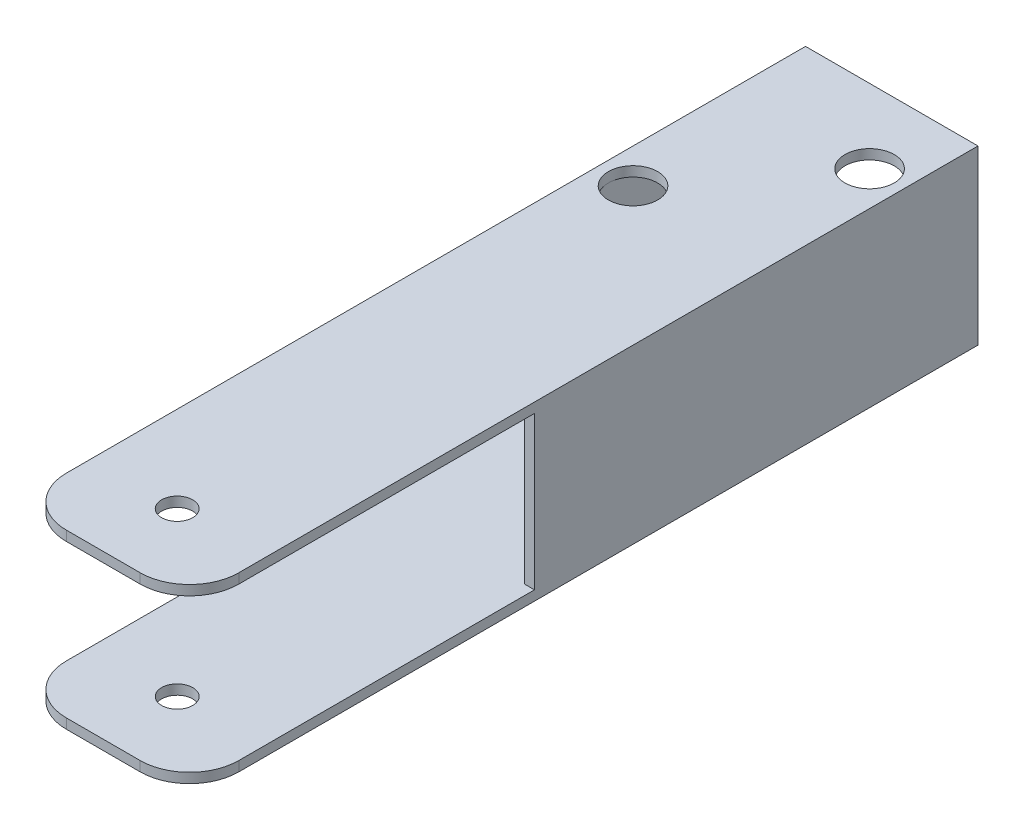
ISO-10303-21;
HEADER;
FILE_DESCRIPTION(('STEP AP214'),'2;1');
FILE_NAME('part.step','',(''),(''),'','','');
FILE_SCHEMA(('AUTOMOTIVE_DESIGN { 1 0 10303 214 1 1 1 1 }'));
ENDSEC;
DATA;
#1=APPLICATION_CONTEXT('core data for automotive mechanical design processes');
#2=APPLICATION_PROTOCOL_DEFINITION('international standard','automotive_design',2000,#1);
#3=PRODUCT_CONTEXT('',#1,'mechanical');
#4=PRODUCT('Part','Part','',(#3));
#5=PRODUCT_RELATED_PRODUCT_CATEGORY('part','',(#4));
#6=PRODUCT_DEFINITION_FORMATION('','',#4);
#7=PRODUCT_DEFINITION_CONTEXT('part definition',#1,'design');
#8=PRODUCT_DEFINITION('design','',#6,#7);
#9=PRODUCT_DEFINITION_SHAPE('','',#8);
#10=(LENGTH_UNIT() NAMED_UNIT(*) SI_UNIT(.MILLI.,.METRE.));
#11=(NAMED_UNIT(*) PLANE_ANGLE_UNIT() SI_UNIT($,.RADIAN.));
#12=(NAMED_UNIT(*) SI_UNIT($,.STERADIAN.) SOLID_ANGLE_UNIT());
#13=UNCERTAINTY_MEASURE_WITH_UNIT(LENGTH_MEASURE(1.E-05),#10,'distance_accuracy_value','');
#14=(GEOMETRIC_REPRESENTATION_CONTEXT(3) GLOBAL_UNCERTAINTY_ASSIGNED_CONTEXT((#13)) GLOBAL_UNIT_ASSIGNED_CONTEXT((#10,
#11,#12)) REPRESENTATION_CONTEXT('',''));
#15=CARTESIAN_POINT('',(0.,0.,0.));
#16=DIRECTION('',(0.,0.,1.));
#17=DIRECTION('',(1.,0.,0.));
#18=AXIS2_PLACEMENT_3D('',#15,#16,#17);
#19=CARTESIAN_POINT('',(0.,0.,185.));
#20=DIRECTION('',(0.,0.,-1.));
#21=DIRECTION('',(-1.,0.,0.));
#22=AXIS2_PLACEMENT_3D('',#19,#20,#21);
#23=PLANE('',#22);
#24=DIRECTION('',(-1.,0.,0.));
#25=VECTOR('',#24,1.);
#26=CARTESIAN_POINT('',(-15.5,15.5,185.));
#27=LINE('',#26,#25);
#28=CARTESIAN_POINT('',(7.50000000000001,15.5,185.));
#29=VERTEX_POINT('',#28);
#30=CARTESIAN_POINT('',(-7.5,15.5,185.));
#31=VERTEX_POINT('',#30);
#32=EDGE_CURVE('E251',#29,#31,#27,.T.);
#33=ORIENTED_EDGE('',*,*,#32,.F.);
#34=DIRECTION('',(0.,1.,0.));
#35=VECTOR('',#34,1.);
#36=CARTESIAN_POINT('',(7.50000000000001,0.,185.));
#37=LINE('',#36,#35);
#38=CARTESIAN_POINT('',(7.5,17.5,185.));
#39=VERTEX_POINT('',#38);
#40=EDGE_CURVE('E289',#29,#39,#37,.T.);
#41=ORIENTED_EDGE('',*,*,#40,.T.);
#42=DIRECTION('',(-1.,0.,0.));
#43=VECTOR('',#42,1.);
#44=CARTESIAN_POINT('',(-17.5,17.5,185.));
#45=LINE('',#44,#43);
#46=CARTESIAN_POINT('',(-7.5,17.5,185.));
#47=VERTEX_POINT('',#46);
#48=EDGE_CURVE('E266',#39,#47,#45,.T.);
#49=ORIENTED_EDGE('',*,*,#48,.T.);
#50=DIRECTION('',(0.,-1.,0.));
#51=VECTOR('',#50,1.);
#52=CARTESIAN_POINT('',(-7.5,0.,185.));
#53=LINE('',#52,#51);
#54=EDGE_CURVE('E284',#47,#31,#53,.T.);
#55=ORIENTED_EDGE('',*,*,#54,.T.);
#56=EDGE_LOOP('',(#33,#41,#49,#55));
#57=FACE_BOUND('',#56,.T.);
#58=ADVANCED_FACE('F45',(#57),#23,.F.);
#59=DIRECTION('',(1.,0.,0.));
#60=VECTOR('',#59,1.);
#61=CARTESIAN_POINT('',(-15.5,-15.5,185.));
#62=LINE('',#61,#60);
#63=CARTESIAN_POINT('',(-7.5,-15.5,185.));
#64=VERTEX_POINT('',#63);
#65=CARTESIAN_POINT('',(7.50000000000001,-15.5,185.));
#66=VERTEX_POINT('',#65);
#67=EDGE_CURVE('E180',#64,#66,#62,.T.);
#68=ORIENTED_EDGE('',*,*,#67,.F.);
#69=DIRECTION('',(0.,-1.,0.));
#70=VECTOR('',#69,1.);
#71=CARTESIAN_POINT('',(-7.5,0.,185.));
#72=LINE('',#71,#70);
#73=CARTESIAN_POINT('',(-7.5,-17.5,185.));
#74=VERTEX_POINT('',#73);
#75=EDGE_CURVE('E311',#64,#74,#72,.T.);
#76=ORIENTED_EDGE('',*,*,#75,.T.);
#77=DIRECTION('',(1.,0.,0.));
#78=VECTOR('',#77,1.);
#79=CARTESIAN_POINT('',(-17.5,-17.5,185.));
#80=LINE('',#79,#78);
#81=CARTESIAN_POINT('',(7.5,-17.5,185.));
#82=VERTEX_POINT('',#81);
#83=EDGE_CURVE('E269',#74,#82,#80,.T.);
#84=ORIENTED_EDGE('',*,*,#83,.T.);
#85=DIRECTION('',(0.,1.,0.));
#86=VECTOR('',#85,1.);
#87=CARTESIAN_POINT('',(7.50000000000001,0.,185.));
#88=LINE('',#87,#86);
#89=EDGE_CURVE('E308',#82,#66,#88,.T.);
#90=ORIENTED_EDGE('',*,*,#89,.T.);
#91=EDGE_LOOP('',(#68,#76,#84,#90));
#92=FACE_BOUND('',#91,.T.);
#93=ADVANCED_FACE('F354',(#92),#23,.F.);
#94=CARTESIAN_POINT('',(17.5,-17.5,185.));
#95=DIRECTION('',(-1.,0.,0.));
#96=DIRECTION('',(0.,0.,1.));
#97=AXIS2_PLACEMENT_3D('',#94,#95,#96);
#98=PLANE('',#97);
#99=DIRECTION('',(0.,0.,-1.));
#100=VECTOR('',#99,1.);
#101=CARTESIAN_POINT('',(17.5,-17.5,185.));
#102=LINE('',#101,#100);
#103=CARTESIAN_POINT('',(17.5,-17.5,175.));
#104=VERTEX_POINT('',#103);
#105=CARTESIAN_POINT('',(17.5,-17.5,25.));
#106=VERTEX_POINT('',#105);
#107=EDGE_CURVE('E272',#104,#106,#102,.T.);
#108=ORIENTED_EDGE('',*,*,#107,.T.);
#109=DIRECTION('',(0.,1.,0.));
#110=VECTOR('',#109,1.);
#111=CARTESIAN_POINT('',(17.5,-17.5,25.));
#112=LINE('',#111,#110);
#113=CARTESIAN_POINT('',(17.5,17.5,25.));
#114=VERTEX_POINT('',#113);
#115=EDGE_CURVE('E210',#106,#114,#112,.T.);
#116=ORIENTED_EDGE('',*,*,#115,.T.);
#117=DIRECTION('',(0.,0.,-1.));
#118=VECTOR('',#117,1.);
#119=CARTESIAN_POINT('',(17.5,17.5,185.));
#120=LINE('',#119,#118);
#121=CARTESIAN_POINT('',(17.5,17.5,175.));
#122=VERTEX_POINT('',#121);
#123=EDGE_CURVE('E281',#122,#114,#120,.T.);
#124=ORIENTED_EDGE('',*,*,#123,.F.);
#125=DIRECTION('',(0.,1.,0.));
#126=VECTOR('',#125,1.);
#127=CARTESIAN_POINT('',(17.5,-17.5,175.));
#128=LINE('',#127,#126);
#129=CARTESIAN_POINT('',(17.5,15.5,175.));
#130=VERTEX_POINT('',#129);
#131=EDGE_CURVE('E298',#122,#130,#128,.F.);
#132=ORIENTED_EDGE('',*,*,#131,.T.);
#133=DIRECTION('',(0.,0.,1.));
#134=VECTOR('',#133,1.);
#135=CARTESIAN_POINT('',(17.5,15.5,185.));
#136=LINE('',#135,#134);
#137=CARTESIAN_POINT('',(17.5,15.5,115.));
#138=VERTEX_POINT('',#137);
#139=EDGE_CURVE('E227',#138,#130,#136,.T.);
#140=ORIENTED_EDGE('',*,*,#139,.F.);
#141=DIRECTION('',(0.,1.,0.));
#142=VECTOR('',#141,1.);
#143=CARTESIAN_POINT('',(17.5,-15.5,115.));
#144=LINE('',#143,#142);
#145=CARTESIAN_POINT('',(17.5,-15.5,115.));
#146=VERTEX_POINT('',#145);
#147=EDGE_CURVE('E235',#146,#138,#144,.T.);
#148=ORIENTED_EDGE('',*,*,#147,.F.);
#149=DIRECTION('',(0.,0.,-1.));
#150=VECTOR('',#149,1.);
#151=CARTESIAN_POINT('',(17.5,-15.5,185.));
#152=LINE('',#151,#150);
#153=CARTESIAN_POINT('',(17.5,-15.5,175.));
#154=VERTEX_POINT('',#153);
#155=EDGE_CURVE('E223',#154,#146,#152,.T.);
#156=ORIENTED_EDGE('',*,*,#155,.F.);
#157=DIRECTION('',(0.,1.,0.));
#158=VECTOR('',#157,1.);
#159=CARTESIAN_POINT('',(17.5,-17.5,175.));
#160=LINE('',#159,#158);
#161=EDGE_CURVE('E296',#154,#104,#160,.F.);
#162=ORIENTED_EDGE('',*,*,#161,.T.);
#163=EDGE_LOOP('',(#108,#116,#124,#132,#140,#148,#156,#162));
#164=FACE_BOUND('',#163,.T.);
#165=ADVANCED_FACE('F361',(#164),#98,.F.);
#166=CARTESIAN_POINT('',(-17.5,17.5,185.));
#167=DIRECTION('',(0.,-1.,0.));
#168=DIRECTION('',(0.,0.,-1.));
#169=AXIS2_PLACEMENT_3D('',#166,#167,#168);
#170=PLANE('',#169);
#171=CARTESIAN_POINT('',(10.5,17.5,40.));
#172=DIRECTION('',(0.,1.,0.));
#173=DIRECTION('',(0.,0.,1.));
#174=AXIS2_PLACEMENT_3D('',#171,#172,#173);
#175=CIRCLE('',#174,5.);
#176=CARTESIAN_POINT('',(10.5,17.5,45.));
#177=VERTEX_POINT('',#176);
#178=EDGE_CURVE('E326',#177,#177,#175,.T.);
#179=ORIENTED_EDGE('',*,*,#178,.F.);
#180=EDGE_LOOP('',(#179));
#181=FACE_BOUND('',#180,.T.);
#182=CARTESIAN_POINT('',(-10.5,17.5,67.));
#183=DIRECTION('',(0.,1.,0.));
#184=DIRECTION('',(0.,0.,1.));
#185=AXIS2_PLACEMENT_3D('',#182,#183,#184);
#186=CIRCLE('',#185,5.);
#187=CARTESIAN_POINT('',(-10.5,17.5,72.));
#188=VERTEX_POINT('',#187);
#189=EDGE_CURVE('E331',#188,#188,#186,.T.);
#190=ORIENTED_EDGE('',*,*,#189,.F.);
#191=EDGE_LOOP('',(#190));
#192=FACE_BOUND('',#191,.T.);
#193=CARTESIAN_POINT('',(0.,17.5,170.));
#194=DIRECTION('',(0.,-1.,0.));
#195=DIRECTION('',(0.,0.,-1.));
#196=AXIS2_PLACEMENT_3D('',#193,#194,#195);
#197=CIRCLE('',#196,3.15);
#198=CARTESIAN_POINT('',(0.,17.5,166.85));
#199=VERTEX_POINT('',#198);
#200=EDGE_CURVE('E214',#199,#199,#197,.T.);
#201=ORIENTED_EDGE('',*,*,#200,.T.);
#202=EDGE_LOOP('',(#201));
#203=FACE_BOUND('',#202,.T.);
#204=ORIENTED_EDGE('',*,*,#123,.T.);
#205=DIRECTION('',(-1.,0.,0.));
#206=VECTOR('',#205,1.);
#207=CARTESIAN_POINT('',(-17.5,17.5,25.));
#208=LINE('',#207,#206);
#209=CARTESIAN_POINT('',(-17.5,17.5,25.));
#210=VERTEX_POINT('',#209);
#211=EDGE_CURVE('E207',#114,#210,#208,.T.);
#212=ORIENTED_EDGE('',*,*,#211,.T.);
#213=DIRECTION('',(0.,0.,-1.));
#214=VECTOR('',#213,1.);
#215=CARTESIAN_POINT('',(-17.5,17.5,185.));
#216=LINE('',#215,#214);
#217=CARTESIAN_POINT('',(-17.5,17.5,175.));
#218=VERTEX_POINT('',#217);
#219=EDGE_CURVE('E278',#218,#210,#216,.T.);
#220=ORIENTED_EDGE('',*,*,#219,.F.);
#221=CARTESIAN_POINT('',(-7.5,17.5,175.));
#222=DIRECTION('',(0.,-1.,0.));
#223=DIRECTION('',(0.,0.,-1.));
#224=AXIS2_PLACEMENT_3D('',#221,#222,#223);
#225=CIRCLE('',#224,10.);
#226=EDGE_CURVE('E292',#218,#47,#225,.F.);
#227=ORIENTED_EDGE('',*,*,#226,.T.);
#228=ORIENTED_EDGE('',*,*,#48,.F.);
#229=CARTESIAN_POINT('',(7.50000000000001,17.5,175.));
#230=DIRECTION('',(0.,-1.,0.));
#231=DIRECTION('',(0.,0.,-1.));
#232=AXIS2_PLACEMENT_3D('',#229,#230,#231);
#233=CIRCLE('',#232,10.);
#234=EDGE_CURVE('E294',#39,#122,#233,.F.);
#235=ORIENTED_EDGE('',*,*,#234,.T.);
#236=EDGE_LOOP('',(#204,#212,#220,#227,#228,#235));
#237=FACE_BOUND('',#236,.T.);
#238=ADVANCED_FACE('F373',(#181,#192,#203,#237),#170,.F.);
#239=CARTESIAN_POINT('',(-17.5,-17.5,185.));
#240=DIRECTION('',(1.,0.,0.));
#241=DIRECTION('',(0.,0.,-1.));
#242=AXIS2_PLACEMENT_3D('',#239,#240,#241);
#243=PLANE('',#242);
#244=ORIENTED_EDGE('',*,*,#219,.T.);
#245=DIRECTION('',(0.,-1.,0.));
#246=VECTOR('',#245,1.);
#247=CARTESIAN_POINT('',(-17.5,-17.5,25.));
#248=LINE('',#247,#246);
#249=CARTESIAN_POINT('',(-17.5,-17.5,25.));
#250=VERTEX_POINT('',#249);
#251=EDGE_CURVE('E200',#210,#250,#248,.T.);
#252=ORIENTED_EDGE('',*,*,#251,.T.);
#253=DIRECTION('',(0.,0.,-1.));
#254=VECTOR('',#253,1.);
#255=CARTESIAN_POINT('',(-17.5,-17.5,185.));
#256=LINE('',#255,#254);
#257=CARTESIAN_POINT('',(-17.5,-17.5,175.));
#258=VERTEX_POINT('',#257);
#259=EDGE_CURVE('E275',#258,#250,#256,.T.);
#260=ORIENTED_EDGE('',*,*,#259,.F.);
#261=DIRECTION('',(0.,-1.,0.));
#262=VECTOR('',#261,1.);
#263=CARTESIAN_POINT('',(-17.5,-17.5,175.));
#264=LINE('',#263,#262);
#265=CARTESIAN_POINT('',(-17.5,-15.5,175.));
#266=VERTEX_POINT('',#265);
#267=EDGE_CURVE('E304',#258,#266,#264,.F.);
#268=ORIENTED_EDGE('',*,*,#267,.T.);
#269=DIRECTION('',(0.,0.,-1.));
#270=VECTOR('',#269,1.);
#271=CARTESIAN_POINT('',(-17.5,-15.5,185.));
#272=LINE('',#271,#270);
#273=CARTESIAN_POINT('',(-17.5,-15.5,115.));
#274=VERTEX_POINT('',#273);
#275=EDGE_CURVE('E224',#266,#274,#272,.T.);
#276=ORIENTED_EDGE('',*,*,#275,.T.);
#277=DIRECTION('',(0.,1.,0.));
#278=VECTOR('',#277,1.);
#279=CARTESIAN_POINT('',(-17.5,-15.5,115.));
#280=LINE('',#279,#278);
#281=CARTESIAN_POINT('',(-17.5,15.5,115.));
#282=VERTEX_POINT('',#281);
#283=EDGE_CURVE('E226',#274,#282,#280,.T.);
#284=ORIENTED_EDGE('',*,*,#283,.T.);
#285=DIRECTION('',(0.,0.,1.));
#286=VECTOR('',#285,1.);
#287=CARTESIAN_POINT('',(-17.5,15.5,185.));
#288=LINE('',#287,#286);
#289=CARTESIAN_POINT('',(-17.5,15.5,175.));
#290=VERTEX_POINT('',#289);
#291=EDGE_CURVE('E230',#282,#290,#288,.T.);
#292=ORIENTED_EDGE('',*,*,#291,.T.);
#293=DIRECTION('',(0.,-1.,0.));
#294=VECTOR('',#293,1.);
#295=CARTESIAN_POINT('',(-17.5,-17.5,175.));
#296=LINE('',#295,#294);
#297=EDGE_CURVE('E306',#290,#218,#296,.F.);
#298=ORIENTED_EDGE('',*,*,#297,.T.);
#299=EDGE_LOOP('',(#244,#252,#260,#268,#276,#284,#292,#298));
#300=FACE_BOUND('',#299,.T.);
#301=ADVANCED_FACE('F370',(#300),#243,.F.);
#302=CARTESIAN_POINT('',(-17.5,-17.5,185.));
#303=DIRECTION('',(0.,1.,0.));
#304=DIRECTION('',(0.,0.,1.));
#305=AXIS2_PLACEMENT_3D('',#302,#303,#304);
#306=PLANE('',#305);
#307=CARTESIAN_POINT('',(10.5,-17.5,40.));
#308=DIRECTION('',(0.,1.,0.));
#309=DIRECTION('',(0.,0.,1.));
#310=AXIS2_PLACEMENT_3D('',#307,#308,#309);
#311=CIRCLE('',#310,5.);
#312=CARTESIAN_POINT('',(10.5,-17.5,45.));
#313=VERTEX_POINT('',#312);
#314=EDGE_CURVE('E321',#313,#313,#311,.T.);
#315=ORIENTED_EDGE('',*,*,#314,.T.);
#316=EDGE_LOOP('',(#315));
#317=FACE_BOUND('',#316,.T.);
#318=CARTESIAN_POINT('',(-10.5,-17.5,67.));
#319=DIRECTION('',(0.,1.,0.));
#320=DIRECTION('',(0.,0.,1.));
#321=AXIS2_PLACEMENT_3D('',#318,#319,#320);
#322=CIRCLE('',#321,5.);
#323=CARTESIAN_POINT('',(-10.5,-17.5,72.));
#324=VERTEX_POINT('',#323);
#325=EDGE_CURVE('E336',#324,#324,#322,.T.);
#326=ORIENTED_EDGE('',*,*,#325,.T.);
#327=EDGE_LOOP('',(#326));
#328=FACE_BOUND('',#327,.T.);
#329=CARTESIAN_POINT('',(0.,-17.5,170.));
#330=DIRECTION('',(0.,-1.,0.));
#331=DIRECTION('',(0.,0.,-1.));
#332=AXIS2_PLACEMENT_3D('',#329,#330,#331);
#333=CIRCLE('',#332,3.15);
#334=CARTESIAN_POINT('',(0.,-17.5,166.85));
#335=VERTEX_POINT('',#334);
#336=EDGE_CURVE('E213',#335,#335,#333,.T.);
#337=ORIENTED_EDGE('',*,*,#336,.F.);
#338=EDGE_LOOP('',(#337));
#339=FACE_BOUND('',#338,.T.);
#340=ORIENTED_EDGE('',*,*,#259,.T.);
#341=DIRECTION('',(1.,0.,0.));
#342=VECTOR('',#341,1.);
#343=CARTESIAN_POINT('',(-17.5,-17.5,25.));
#344=LINE('',#343,#342);
#345=EDGE_CURVE('E196',#250,#106,#344,.T.);
#346=ORIENTED_EDGE('',*,*,#345,.T.);
#347=ORIENTED_EDGE('',*,*,#107,.F.);
#348=CARTESIAN_POINT('',(7.50000000000001,-17.5,175.));
#349=DIRECTION('',(0.,1.,0.));
#350=DIRECTION('',(0.,0.,1.));
#351=AXIS2_PLACEMENT_3D('',#348,#349,#350);
#352=CIRCLE('',#351,10.);
#353=EDGE_CURVE('E314',#104,#82,#352,.F.);
#354=ORIENTED_EDGE('',*,*,#353,.T.);
#355=ORIENTED_EDGE('',*,*,#83,.F.);
#356=CARTESIAN_POINT('',(-7.5,-17.5,175.));
#357=DIRECTION('',(0.,1.,0.));
#358=DIRECTION('',(0.,0.,1.));
#359=AXIS2_PLACEMENT_3D('',#356,#357,#358);
#360=CIRCLE('',#359,10.);
#361=EDGE_CURVE('E316',#74,#258,#360,.F.);
#362=ORIENTED_EDGE('',*,*,#361,.T.);
#363=EDGE_LOOP('',(#340,#346,#347,#354,#355,#362));
#364=FACE_BOUND('',#363,.T.);
#365=ADVANCED_FACE('F367',(#317,#328,#339,#364),#306,.F.);
#366=CARTESIAN_POINT('',(15.5,-15.5,185.));
#367=DIRECTION('',(-1.,0.,0.));
#368=DIRECTION('',(0.,0.,1.));
#369=AXIS2_PLACEMENT_3D('',#366,#367,#368);
#370=PLANE('',#369);
#371=DIRECTION('',(0.,0.,-1.));
#372=VECTOR('',#371,1.);
#373=CARTESIAN_POINT('',(15.5,15.5,185.));
#374=LINE('',#373,#372);
#375=CARTESIAN_POINT('',(15.5,15.5,115.));
#376=VERTEX_POINT('',#375);
#377=CARTESIAN_POINT('',(15.5,15.5,40.));
#378=VERTEX_POINT('',#377);
#379=EDGE_CURVE('E264',#376,#378,#374,.T.);
#380=ORIENTED_EDGE('',*,*,#379,.T.);
#381=CARTESIAN_POINT('',(15.5,15.5,25.));
#382=VERTEX_POINT('',#381);
#383=EDGE_CURVE('E195',#378,#382,#374,.T.);
#384=ORIENTED_EDGE('',*,*,#383,.T.);
#385=DIRECTION('',(0.,1.,0.));
#386=VECTOR('',#385,1.);
#387=CARTESIAN_POINT('',(15.5,-15.5,25.));
#388=LINE('',#387,#386);
#389=CARTESIAN_POINT('',(15.5,-15.5,25.));
#390=VERTEX_POINT('',#389);
#391=EDGE_CURVE('E188',#390,#382,#388,.T.);
#392=ORIENTED_EDGE('',*,*,#391,.F.);
#393=DIRECTION('',(0.,0.,-1.));
#394=VECTOR('',#393,1.);
#395=CARTESIAN_POINT('',(15.5,-15.5,185.));
#396=LINE('',#395,#394);
#397=CARTESIAN_POINT('',(15.5,-15.5,40.));
#398=VERTEX_POINT('',#397);
#399=EDGE_CURVE('E171',#398,#390,#396,.T.);
#400=ORIENTED_EDGE('',*,*,#399,.F.);
#401=CARTESIAN_POINT('',(15.5,-15.5,115.));
#402=VERTEX_POINT('',#401);
#403=EDGE_CURVE('E179',#402,#398,#396,.T.);
#404=ORIENTED_EDGE('',*,*,#403,.F.);
#405=DIRECTION('',(0.,-1.,0.));
#406=VECTOR('',#405,1.);
#407=CARTESIAN_POINT('',(15.5,-15.5,115.));
#408=LINE('',#407,#406);
#409=EDGE_CURVE('E248',#376,#402,#408,.T.);
#410=ORIENTED_EDGE('',*,*,#409,.F.);
#411=EDGE_LOOP('',(#380,#384,#392,#400,#404,#410));
#412=FACE_BOUND('',#411,.T.);
#413=ADVANCED_FACE('F193',(#412),#370,.T.);
#414=CARTESIAN_POINT('',(-15.5,15.5,185.));
#415=DIRECTION('',(0.,-1.,0.));
#416=DIRECTION('',(0.,0.,-1.));
#417=AXIS2_PLACEMENT_3D('',#414,#415,#416);
#418=PLANE('',#417);
#419=ORIENTED_EDGE('',*,*,#383,.F.);
#420=CARTESIAN_POINT('',(10.5,15.5,40.));
#421=DIRECTION('',(0.,-1.,0.));
#422=DIRECTION('',(0.,0.,-1.));
#423=AXIS2_PLACEMENT_3D('',#420,#421,#422);
#424=CIRCLE('',#423,5.);
#425=EDGE_CURVE('E60',#378,#378,#424,.T.);
#426=ORIENTED_EDGE('',*,*,#425,.F.);
#427=ORIENTED_EDGE('',*,*,#379,.F.);
#428=DIRECTION('',(1.,0.,0.));
#429=VECTOR('',#428,1.);
#430=CARTESIAN_POINT('',(-17.5,15.5,115.));
#431=LINE('',#430,#429);
#432=EDGE_CURVE('E244',#376,#138,#431,.T.);
#433=ORIENTED_EDGE('',*,*,#432,.T.);
#434=ORIENTED_EDGE('',*,*,#139,.T.);
#435=CARTESIAN_POINT('',(7.50000000000001,15.5,175.));
#436=DIRECTION('',(0.,-1.,0.));
#437=DIRECTION('',(0.,0.,-1.));
#438=AXIS2_PLACEMENT_3D('',#435,#436,#437);
#439=CIRCLE('',#438,10.);
#440=EDGE_CURVE('E302',#130,#29,#439,.T.);
#441=ORIENTED_EDGE('',*,*,#440,.T.);
#442=ORIENTED_EDGE('',*,*,#32,.T.);
#443=CARTESIAN_POINT('',(-7.5,15.5,175.));
#444=DIRECTION('',(0.,-1.,0.));
#445=DIRECTION('',(0.,0.,-1.));
#446=AXIS2_PLACEMENT_3D('',#443,#444,#445);
#447=CIRCLE('',#446,10.);
#448=EDGE_CURVE('E300',#31,#290,#447,.T.);
#449=ORIENTED_EDGE('',*,*,#448,.T.);
#450=ORIENTED_EDGE('',*,*,#291,.F.);
#451=CARTESIAN_POINT('',(-15.5,15.5,115.));
#452=VERTEX_POINT('',#451);
#453=EDGE_CURVE('E240',#282,#452,#431,.T.);
#454=ORIENTED_EDGE('',*,*,#453,.T.);
#455=DIRECTION('',(0.,0.,-1.));
#456=VECTOR('',#455,1.);
#457=CARTESIAN_POINT('',(-15.5,15.5,185.));
#458=LINE('',#457,#456);
#459=CARTESIAN_POINT('',(-15.5,15.5,67.));
#460=VERTEX_POINT('',#459);
#461=EDGE_CURVE('E261',#452,#460,#458,.T.);
#462=ORIENTED_EDGE('',*,*,#461,.T.);
#463=CARTESIAN_POINT('',(-10.5,15.5,67.));
#464=DIRECTION('',(0.,-1.,0.));
#465=DIRECTION('',(0.,0.,-1.));
#466=AXIS2_PLACEMENT_3D('',#463,#464,#465);
#467=CIRCLE('',#466,5.);
#468=EDGE_CURVE('E65',#460,#460,#467,.T.);
#469=ORIENTED_EDGE('',*,*,#468,.F.);
#470=CARTESIAN_POINT('',(-15.5,15.5,25.));
#471=VERTEX_POINT('',#470);
#472=EDGE_CURVE('E260',#460,#471,#458,.T.);
#473=ORIENTED_EDGE('',*,*,#472,.T.);
#474=DIRECTION('',(-1.,0.,0.));
#475=VECTOR('',#474,1.);
#476=CARTESIAN_POINT('',(-15.5,15.5,25.));
#477=LINE('',#476,#475);
#478=EDGE_CURVE('E197',#382,#471,#477,.T.);
#479=ORIENTED_EDGE('',*,*,#478,.F.);
#480=EDGE_LOOP('',(#419,#426,#427,#433,#434,#441,#442,#449,#450,#454,#462,#469,#473,#479));
#481=FACE_BOUND('',#480,.T.);
#482=CARTESIAN_POINT('',(0.,15.5,170.));
#483=DIRECTION('',(0.,-1.,0.));
#484=DIRECTION('',(0.,0.,-1.));
#485=AXIS2_PLACEMENT_3D('',#482,#483,#484);
#486=CIRCLE('',#485,3.15);
#487=CARTESIAN_POINT('',(0.,15.5,166.85));
#488=VERTEX_POINT('',#487);
#489=EDGE_CURVE('E220',#488,#488,#486,.T.);
#490=ORIENTED_EDGE('',*,*,#489,.F.);
#491=EDGE_LOOP('',(#490));
#492=FACE_BOUND('',#491,.T.);
#493=ADVANCED_FACE('F416',(#481,#492),#418,.T.);
#494=CARTESIAN_POINT('',(-15.5,-15.5,185.));
#495=DIRECTION('',(1.,0.,0.));
#496=DIRECTION('',(0.,0.,-1.));
#497=AXIS2_PLACEMENT_3D('',#494,#495,#496);
#498=PLANE('',#497);
#499=ORIENTED_EDGE('',*,*,#472,.F.);
#500=ORIENTED_EDGE('',*,*,#461,.F.);
#501=DIRECTION('',(0.,1.,0.));
#502=VECTOR('',#501,1.);
#503=CARTESIAN_POINT('',(-15.5,-15.5,115.));
#504=LINE('',#503,#502);
#505=CARTESIAN_POINT('',(-15.5,-15.5,115.));
#506=VERTEX_POINT('',#505);
#507=EDGE_CURVE('E243',#506,#452,#504,.T.);
#508=ORIENTED_EDGE('',*,*,#507,.F.);
#509=DIRECTION('',(0.,0.,-1.));
#510=VECTOR('',#509,1.);
#511=CARTESIAN_POINT('',(-15.5,-15.5,185.));
#512=LINE('',#511,#510);
#513=CARTESIAN_POINT('',(-15.5,-15.5,67.));
#514=VERTEX_POINT('',#513);
#515=EDGE_CURVE('E257',#506,#514,#512,.T.);
#516=ORIENTED_EDGE('',*,*,#515,.T.);
#517=CARTESIAN_POINT('',(-15.5,-15.5,25.));
#518=VERTEX_POINT('',#517);
#519=EDGE_CURVE('E256',#514,#518,#512,.T.);
#520=ORIENTED_EDGE('',*,*,#519,.T.);
#521=DIRECTION('',(0.,-1.,0.));
#522=VECTOR('',#521,1.);
#523=CARTESIAN_POINT('',(-15.5,-15.5,25.));
#524=LINE('',#523,#522);
#525=EDGE_CURVE('E191',#471,#518,#524,.T.);
#526=ORIENTED_EDGE('',*,*,#525,.F.);
#527=EDGE_LOOP('',(#499,#500,#508,#516,#520,#526));
#528=FACE_BOUND('',#527,.T.);
#529=ADVANCED_FACE('F420',(#528),#498,.T.);
#530=CARTESIAN_POINT('',(-15.5,-15.5,185.));
#531=DIRECTION('',(0.,1.,0.));
#532=DIRECTION('',(0.,0.,1.));
#533=AXIS2_PLACEMENT_3D('',#530,#531,#532);
#534=PLANE('',#533);
#535=ORIENTED_EDGE('',*,*,#403,.T.);
#536=CARTESIAN_POINT('',(10.5,-15.5,40.));
#537=DIRECTION('',(0.,1.,0.));
#538=DIRECTION('',(0.,0.,1.));
#539=AXIS2_PLACEMENT_3D('',#536,#537,#538);
#540=CIRCLE('',#539,5.);
#541=EDGE_CURVE('E49',#398,#398,#540,.T.);
#542=ORIENTED_EDGE('',*,*,#541,.F.);
#543=ORIENTED_EDGE('',*,*,#399,.T.);
#544=DIRECTION('',(1.,0.,0.));
#545=VECTOR('',#544,1.);
#546=CARTESIAN_POINT('',(-15.5,-15.5,25.));
#547=LINE('',#546,#545);
#548=EDGE_CURVE('E11',#518,#390,#547,.T.);
#549=ORIENTED_EDGE('',*,*,#548,.F.);
#550=ORIENTED_EDGE('',*,*,#519,.F.);
#551=CARTESIAN_POINT('',(-10.5,-15.5,67.));
#552=DIRECTION('',(0.,1.,0.));
#553=DIRECTION('',(0.,0.,1.));
#554=AXIS2_PLACEMENT_3D('',#551,#552,#553);
#555=CIRCLE('',#554,5.);
#556=EDGE_CURVE('E320',#514,#514,#555,.T.);
#557=ORIENTED_EDGE('',*,*,#556,.F.);
#558=ORIENTED_EDGE('',*,*,#515,.F.);
#559=DIRECTION('',(1.,0.,0.));
#560=VECTOR('',#559,1.);
#561=CARTESIAN_POINT('',(-17.5,-15.5,115.));
#562=LINE('',#561,#560);
#563=EDGE_CURVE('E245',#274,#506,#562,.T.);
#564=ORIENTED_EDGE('',*,*,#563,.F.);
#565=ORIENTED_EDGE('',*,*,#275,.F.);
#566=CARTESIAN_POINT('',(-7.5,-15.5,175.));
#567=DIRECTION('',(0.,1.,0.));
#568=DIRECTION('',(0.,0.,1.));
#569=AXIS2_PLACEMENT_3D('',#566,#567,#568);
#570=CIRCLE('',#569,10.);
#571=EDGE_CURVE('E54',#266,#64,#570,.T.);
#572=ORIENTED_EDGE('',*,*,#571,.T.);
#573=ORIENTED_EDGE('',*,*,#67,.T.);
#574=CARTESIAN_POINT('',(7.50000000000001,-15.5,175.));
#575=DIRECTION('',(0.,1.,0.));
#576=DIRECTION('',(0.,0.,1.));
#577=AXIS2_PLACEMENT_3D('',#574,#575,#576);
#578=CIRCLE('',#577,10.);
#579=EDGE_CURVE('E318',#66,#154,#578,.T.);
#580=ORIENTED_EDGE('',*,*,#579,.T.);
#581=ORIENTED_EDGE('',*,*,#155,.T.);
#582=EDGE_CURVE('E233',#402,#146,#562,.T.);
#583=ORIENTED_EDGE('',*,*,#582,.F.);
#584=EDGE_LOOP('',(#535,#542,#543,#549,#550,#557,#558,#564,#565,#572,#573,#580,#581,#583));
#585=FACE_BOUND('',#584,.T.);
#586=CARTESIAN_POINT('',(0.,-15.5,170.));
#587=DIRECTION('',(0.,1.,0.));
#588=DIRECTION('',(0.,0.,1.));
#589=AXIS2_PLACEMENT_3D('',#586,#587,#588);
#590=CIRCLE('',#589,3.15);
#591=CARTESIAN_POINT('',(0.,-15.5,173.15));
#592=VERTEX_POINT('',#591);
#593=EDGE_CURVE('E217',#592,#592,#590,.T.);
#594=ORIENTED_EDGE('',*,*,#593,.F.);
#595=EDGE_LOOP('',(#594));
#596=FACE_BOUND('',#595,.T.);
#597=ADVANCED_FACE('F173',(#585,#596),#534,.T.);
#598=CARTESIAN_POINT('',(-17.5,-15.5,115.));
#599=DIRECTION('',(0.,0.,-1.));
#600=DIRECTION('',(-1.,0.,0.));
#601=AXIS2_PLACEMENT_3D('',#598,#599,#600);
#602=PLANE('',#601);
#603=ORIENTED_EDGE('',*,*,#507,.T.);
#604=ORIENTED_EDGE('',*,*,#453,.F.);
#605=ORIENTED_EDGE('',*,*,#283,.F.);
#606=ORIENTED_EDGE('',*,*,#563,.T.);
#607=EDGE_LOOP('',(#603,#604,#605,#606));
#608=FACE_BOUND('',#607,.T.);
#609=ADVANCED_FACE('F426',(#608),#602,.F.);
#610=ORIENTED_EDGE('',*,*,#409,.T.);
#611=ORIENTED_EDGE('',*,*,#582,.T.);
#612=ORIENTED_EDGE('',*,*,#147,.T.);
#613=ORIENTED_EDGE('',*,*,#432,.F.);
#614=EDGE_LOOP('',(#610,#611,#612,#613));
#615=FACE_BOUND('',#614,.T.);
#616=ADVANCED_FACE('F412',(#615),#602,.F.);
#617=CARTESIAN_POINT('',(0.,17.5,170.));
#618=DIRECTION('',(0.,-1.,0.));
#619=DIRECTION('',(0.,0.,-1.));
#620=AXIS2_PLACEMENT_3D('',#617,#618,#619);
#621=CYLINDRICAL_SURFACE('',#620,3.15);
#622=ORIENTED_EDGE('',*,*,#593,.T.);
#623=EDGE_LOOP('',(#622));
#624=FACE_BOUND('',#623,.T.);
#625=ORIENTED_EDGE('',*,*,#336,.T.);
#626=EDGE_LOOP('',(#625));
#627=FACE_BOUND('',#626,.T.);
#628=ADVANCED_FACE('F445',(#624,#627),#621,.F.);
#629=ORIENTED_EDGE('',*,*,#489,.T.);
#630=EDGE_LOOP('',(#629));
#631=FACE_BOUND('',#630,.T.);
#632=ORIENTED_EDGE('',*,*,#200,.F.);
#633=EDGE_LOOP('',(#632));
#634=FACE_BOUND('',#633,.T.);
#635=ADVANCED_FACE('F385',(#631,#634),#621,.F.);
#636=CARTESIAN_POINT('',(7.50000000000001,0.,175.));
#637=DIRECTION('',(0.,1.,0.));
#638=DIRECTION('',(0.,0.,1.));
#639=AXIS2_PLACEMENT_3D('',#636,#637,#638);
#640=CYLINDRICAL_SURFACE('',#639,10.);
#641=ORIENTED_EDGE('',*,*,#440,.F.);
#642=ORIENTED_EDGE('',*,*,#131,.F.);
#643=ORIENTED_EDGE('',*,*,#234,.F.);
#644=ORIENTED_EDGE('',*,*,#40,.F.);
#645=EDGE_LOOP('',(#641,#642,#643,#644));
#646=FACE_BOUND('',#645,.T.);
#647=ADVANCED_FACE('F381',(#646),#640,.T.);
#648=CARTESIAN_POINT('',(-7.5,0.,175.));
#649=DIRECTION('',(0.,-1.,0.));
#650=DIRECTION('',(0.,0.,-1.));
#651=AXIS2_PLACEMENT_3D('',#648,#649,#650);
#652=CYLINDRICAL_SURFACE('',#651,10.);
#653=ORIENTED_EDGE('',*,*,#226,.F.);
#654=ORIENTED_EDGE('',*,*,#297,.F.);
#655=ORIENTED_EDGE('',*,*,#448,.F.);
#656=ORIENTED_EDGE('',*,*,#54,.F.);
#657=EDGE_LOOP('',(#653,#654,#655,#656));
#658=FACE_BOUND('',#657,.T.);
#659=ADVANCED_FACE('F384',(#658),#652,.T.);
#660=CARTESIAN_POINT('',(-7.5,0.,175.));
#661=DIRECTION('',(0.,-1.,0.));
#662=DIRECTION('',(0.,0.,-1.));
#663=AXIS2_PLACEMENT_3D('',#660,#661,#662);
#664=CYLINDRICAL_SURFACE('',#663,10.);
#665=ORIENTED_EDGE('',*,*,#571,.F.);
#666=ORIENTED_EDGE('',*,*,#267,.F.);
#667=ORIENTED_EDGE('',*,*,#361,.F.);
#668=ORIENTED_EDGE('',*,*,#75,.F.);
#669=EDGE_LOOP('',(#665,#666,#667,#668));
#670=FACE_BOUND('',#669,.T.);
#671=ADVANCED_FACE('F388',(#670),#664,.T.);
#672=CARTESIAN_POINT('',(7.50000000000001,0.,175.));
#673=DIRECTION('',(0.,1.,0.));
#674=DIRECTION('',(0.,0.,1.));
#675=AXIS2_PLACEMENT_3D('',#672,#673,#674);
#676=CYLINDRICAL_SURFACE('',#675,10.);
#677=ORIENTED_EDGE('',*,*,#353,.F.);
#678=ORIENTED_EDGE('',*,*,#161,.F.);
#679=ORIENTED_EDGE('',*,*,#579,.F.);
#680=ORIENTED_EDGE('',*,*,#89,.F.);
#681=EDGE_LOOP('',(#677,#678,#679,#680));
#682=FACE_BOUND('',#681,.T.);
#683=ADVANCED_FACE('F47',(#682),#676,.T.);
#684=CARTESIAN_POINT('',(0.,0.,25.));
#685=DIRECTION('',(0.,0.,1.));
#686=DIRECTION('',(1.,0.,0.));
#687=AXIS2_PLACEMENT_3D('',#684,#685,#686);
#688=PLANE('',#687);
#689=ORIENTED_EDGE('',*,*,#391,.T.);
#690=ORIENTED_EDGE('',*,*,#478,.T.);
#691=ORIENTED_EDGE('',*,*,#525,.T.);
#692=ORIENTED_EDGE('',*,*,#548,.T.);
#693=EDGE_LOOP('',(#689,#690,#691,#692));
#694=FACE_BOUND('',#693,.T.);
#695=ORIENTED_EDGE('',*,*,#345,.F.);
#696=ORIENTED_EDGE('',*,*,#251,.F.);
#697=ORIENTED_EDGE('',*,*,#211,.F.);
#698=ORIENTED_EDGE('',*,*,#115,.F.);
#699=EDGE_LOOP('',(#695,#696,#697,#698));
#700=FACE_BOUND('',#699,.T.);
#701=ADVANCED_FACE('F185',(#694,#700),#688,.F.);
#702=CARTESIAN_POINT('',(-10.5,-17.5,67.));
#703=DIRECTION('',(0.,1.,0.));
#704=DIRECTION('',(0.,0.,1.));
#705=AXIS2_PLACEMENT_3D('',#702,#703,#704);
#706=CYLINDRICAL_SURFACE('',#705,5.);
#707=ORIENTED_EDGE('',*,*,#556,.T.);
#708=EDGE_LOOP('',(#707));
#709=FACE_BOUND('',#708,.T.);
#710=ORIENTED_EDGE('',*,*,#325,.F.);
#711=EDGE_LOOP('',(#710));
#712=FACE_BOUND('',#711,.T.);
#713=ADVANCED_FACE('F344',(#709,#712),#706,.F.);
#714=CARTESIAN_POINT('',(10.5,-17.5,40.));
#715=DIRECTION('',(0.,1.,0.));
#716=DIRECTION('',(0.,0.,1.));
#717=AXIS2_PLACEMENT_3D('',#714,#715,#716);
#718=CYLINDRICAL_SURFACE('',#717,5.);
#719=ORIENTED_EDGE('',*,*,#541,.T.);
#720=EDGE_LOOP('',(#719));
#721=FACE_BOUND('',#720,.T.);
#722=ORIENTED_EDGE('',*,*,#314,.F.);
#723=EDGE_LOOP('',(#722));
#724=FACE_BOUND('',#723,.T.);
#725=ADVANCED_FACE('F340',(#721,#724),#718,.F.);
#726=ORIENTED_EDGE('',*,*,#468,.T.);
#727=EDGE_LOOP('',(#726));
#728=FACE_BOUND('',#727,.T.);
#729=ORIENTED_EDGE('',*,*,#189,.T.);
#730=EDGE_LOOP('',(#729));
#731=FACE_BOUND('',#730,.T.);
#732=ADVANCED_FACE('F343',(#728,#731),#706,.F.);
#733=ORIENTED_EDGE('',*,*,#425,.T.);
#734=EDGE_LOOP('',(#733));
#735=FACE_BOUND('',#734,.T.);
#736=ORIENTED_EDGE('',*,*,#178,.T.);
#737=EDGE_LOOP('',(#736));
#738=FACE_BOUND('',#737,.T.);
#739=ADVANCED_FACE('F346',(#735,#738),#718,.F.);
#740=CLOSED_SHELL('',(#58,#93,#165,#238,#301,#365,#413,#493,#529,#597,#609,#616,#628,#635,#647,
#659,#671,#683,#701,#713,#725,#732,#739));
#741=MANIFOLD_SOLID_BREP('B2',#740);
#742=ADVANCED_BREP_SHAPE_REPRESENTATION('',(#18,#741),#14);
#743=SHAPE_DEFINITION_REPRESENTATION(#9,#742);
ENDSEC;
END-ISO-10303-21;
